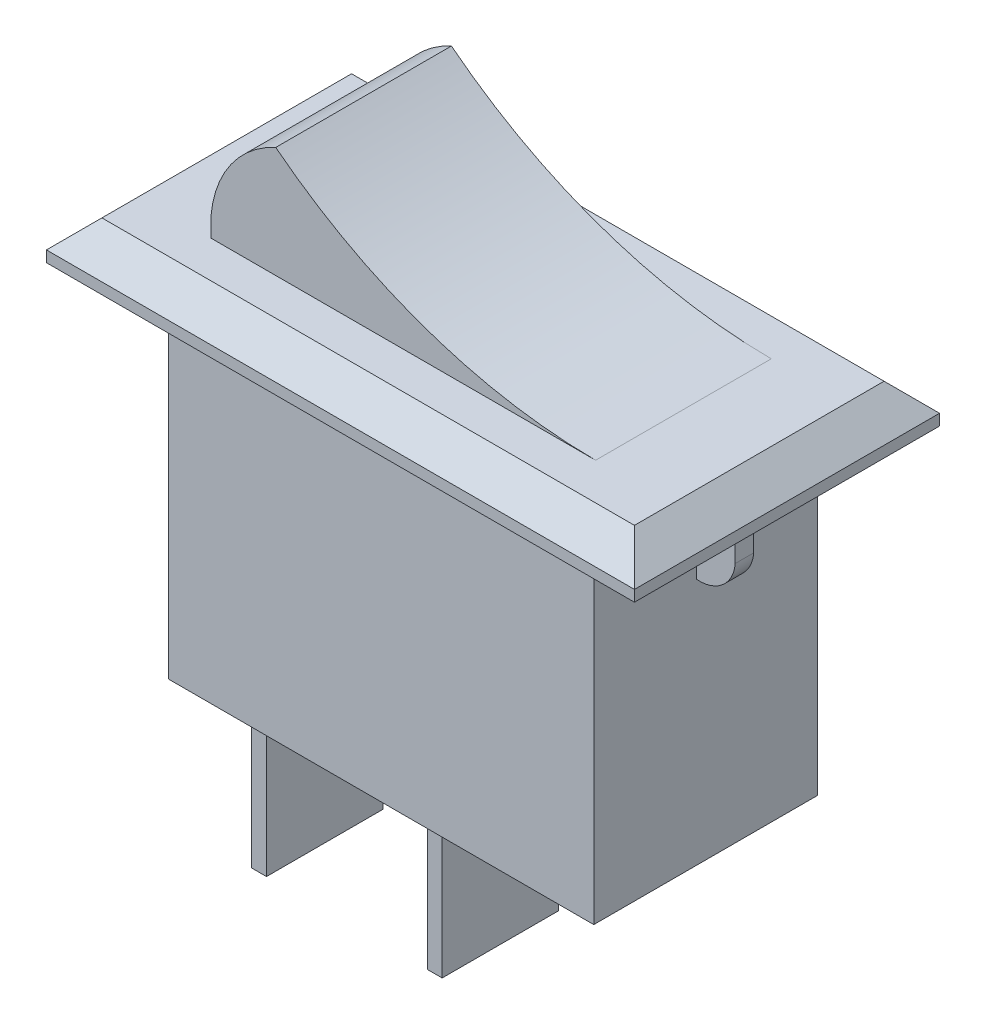
ISO-10303-21;
HEADER;
FILE_DESCRIPTION(('STEP AP214'),'2;1');
FILE_NAME('part.step','',(''),(''),'','','');
FILE_SCHEMA(('AUTOMOTIVE_DESIGN { 1 0 10303 214 1 1 1 1 }'));
ENDSEC;
DATA;
#1=APPLICATION_CONTEXT('core data for automotive mechanical design processes');
#2=APPLICATION_PROTOCOL_DEFINITION('international standard','automotive_design',2000,#1);
#3=PRODUCT_CONTEXT('',#1,'mechanical');
#4=PRODUCT('Part','Part','',(#3));
#5=PRODUCT_RELATED_PRODUCT_CATEGORY('part','',(#4));
#6=PRODUCT_DEFINITION_FORMATION('','',#4);
#7=PRODUCT_DEFINITION_CONTEXT('part definition',#1,'design');
#8=PRODUCT_DEFINITION('design','',#6,#7);
#9=PRODUCT_DEFINITION_SHAPE('','',#8);
#10=(LENGTH_UNIT() NAMED_UNIT(*) SI_UNIT(.MILLI.,.METRE.));
#11=(NAMED_UNIT(*) PLANE_ANGLE_UNIT() SI_UNIT($,.RADIAN.));
#12=(NAMED_UNIT(*) SI_UNIT($,.STERADIAN.) SOLID_ANGLE_UNIT());
#13=UNCERTAINTY_MEASURE_WITH_UNIT(LENGTH_MEASURE(1.E-05),#10,'distance_accuracy_value','');
#14=(GEOMETRIC_REPRESENTATION_CONTEXT(3) GLOBAL_UNCERTAINTY_ASSIGNED_CONTEXT((#13)) GLOBAL_UNIT_ASSIGNED_CONTEXT((#10,
#11,#12)) REPRESENTATION_CONTEXT('',''));
#15=CARTESIAN_POINT('',(0.,0.,0.));
#16=DIRECTION('',(0.,0.,1.));
#17=DIRECTION('',(1.,0.,0.));
#18=AXIS2_PLACEMENT_3D('',#15,#16,#17);
#19=CARTESIAN_POINT('',(0.999999999999998,26.5,-1.3));
#20=DIRECTION('',(0.,0.,-1.));
#21=DIRECTION('',(-1.,0.,0.));
#22=AXIS2_PLACEMENT_3D('',#19,#20,#21);
#23=PLANE('',#22);
#24=DIRECTION('',(1.,0.,0.));
#25=VECTOR('',#24,1.);
#26=CARTESIAN_POINT('',(0.999999999999998,20.5,-1.3));
#27=LINE('',#26,#25);
#28=CARTESIAN_POINT('',(0.999999999999998,20.5,-1.3));
#29=VERTEX_POINT('',#28);
#30=CARTESIAN_POINT('',(21.7997594752728,20.5,-1.3));
#31=VERTEX_POINT('',#30);
#32=EDGE_CURVE('E284',#29,#31,#27,.T.);
#33=ORIENTED_EDGE('',*,*,#32,.T.);
#34=CARTESIAN_POINT('',(21.8998797376371,48.7288159014414,-1.3));
#35=DIRECTION('',(0.,0.,1.));
#36=DIRECTION('',(1.,0.,0.));
#37=AXIS2_PLACEMENT_3D('',#34,#35,#36);
#38=CIRCLE('',#37,28.2289934511383);
#39=CARTESIAN_POINT('',(4.5,26.5,-1.3));
#40=VERTEX_POINT('',#39);
#41=EDGE_CURVE('E275',#40,#31,#38,.T.);
#42=ORIENTED_EDGE('',*,*,#41,.F.);
#43=CARTESIAN_POINT('',(6.99755623346389,21.0222588638127,-1.3));
#44=DIRECTION('',(0.,0.,1.));
#45=DIRECTION('',(1.,0.,0.));
#46=AXIS2_PLACEMENT_3D('',#43,#44,#45);
#47=CIRCLE('',#46,6.02025207897415);
#48=CARTESIAN_POINT('',(0.999999999999997,21.5445177276255,-1.3));
#49=VERTEX_POINT('',#48);
#50=EDGE_CURVE('E283',#49,#40,#47,.F.);
#51=ORIENTED_EDGE('',*,*,#50,.F.);
#52=DIRECTION('',(0.,-1.,0.));
#53=VECTOR('',#52,1.);
#54=CARTESIAN_POINT('',(0.999999999999998,26.5,-1.3));
#55=LINE('',#54,#53);
#56=EDGE_CURVE('E83',#49,#29,#55,.T.);
#57=ORIENTED_EDGE('',*,*,#56,.T.);
#58=EDGE_LOOP('',(#33,#42,#51,#57));
#59=FACE_BOUND('',#58,.T.);
#60=ADVANCED_FACE('F57',(#59),#23,.F.);
#61=CARTESIAN_POINT('',(0.999999999999997,26.5,-10.8));
#62=DIRECTION('',(0.,0.,1.));
#63=DIRECTION('',(1.,0.,0.));
#64=AXIS2_PLACEMENT_3D('',#61,#62,#63);
#65=PLANE('',#64);
#66=CARTESIAN_POINT('',(6.99755623346389,21.0222588638127,-10.8));
#67=DIRECTION('',(0.,0.,1.));
#68=DIRECTION('',(1.,0.,0.));
#69=AXIS2_PLACEMENT_3D('',#66,#67,#68);
#70=CIRCLE('',#69,6.02025207897415);
#71=CARTESIAN_POINT('',(4.5,26.5,-10.8));
#72=VERTEX_POINT('',#71);
#73=CARTESIAN_POINT('',(0.999999999999997,21.5445177276255,-10.8));
#74=VERTEX_POINT('',#73);
#75=EDGE_CURVE('E280',#72,#74,#70,.T.);
#76=ORIENTED_EDGE('',*,*,#75,.F.);
#77=CARTESIAN_POINT('',(21.8998797376371,48.7288159014414,-10.8));
#78=DIRECTION('',(0.,0.,1.));
#79=DIRECTION('',(1.,0.,0.));
#80=AXIS2_PLACEMENT_3D('',#77,#78,#79);
#81=CIRCLE('',#80,28.2289934511383);
#82=CARTESIAN_POINT('',(21.7997594752728,20.5,-10.8));
#83=VERTEX_POINT('',#82);
#84=EDGE_CURVE('E276',#83,#72,#81,.F.);
#85=ORIENTED_EDGE('',*,*,#84,.F.);
#86=DIRECTION('',(-1.,0.,0.));
#87=VECTOR('',#86,1.);
#88=CARTESIAN_POINT('',(0.999999999999997,20.5,-10.8));
#89=LINE('',#88,#87);
#90=CARTESIAN_POINT('',(0.999999999999997,20.5,-10.8));
#91=VERTEX_POINT('',#90);
#92=EDGE_CURVE('E75',#83,#91,#89,.T.);
#93=ORIENTED_EDGE('',*,*,#92,.T.);
#94=DIRECTION('',(0.,-1.,0.));
#95=VECTOR('',#94,1.);
#96=CARTESIAN_POINT('',(0.999999999999997,26.5,-10.8));
#97=LINE('',#96,#95);
#98=EDGE_CURVE('E300',#74,#91,#97,.T.);
#99=ORIENTED_EDGE('',*,*,#98,.F.);
#100=EDGE_LOOP('',(#76,#85,#93,#99));
#101=FACE_BOUND('',#100,.T.);
#102=ADVANCED_FACE('F550',(#101),#65,.F.);
#103=CARTESIAN_POINT('',(0.,20.5,0.));
#104=DIRECTION('',(0.,-1.,0.));
#105=DIRECTION('',(0.,0.,-1.));
#106=AXIS2_PLACEMENT_3D('',#103,#104,#105);
#107=PLANE('',#106);
#108=ORIENTED_EDGE('',*,*,#92,.F.);
#109=DIRECTION('',(0.,0.,1.));
#110=VECTOR('',#109,1.);
#111=CARTESIAN_POINT('',(21.7997594752728,20.5,-29.3));
#112=LINE('',#111,#110);
#113=EDGE_CURVE('E285',#83,#31,#112,.T.);
#114=ORIENTED_EDGE('',*,*,#113,.T.);
#115=ORIENTED_EDGE('',*,*,#32,.F.);
#116=DIRECTION('',(0.,0.,1.));
#117=VECTOR('',#116,1.);
#118=CARTESIAN_POINT('',(0.999999999999997,20.5,-10.8));
#119=LINE('',#118,#117);
#120=EDGE_CURVE('E295',#91,#29,#119,.T.);
#121=ORIENTED_EDGE('',*,*,#120,.F.);
#122=EDGE_LOOP('',(#108,#114,#115,#121));
#123=FACE_BOUND('',#122,.T.);
#124=DIRECTION('',(0.,0.,-1.));
#125=VECTOR('',#124,1.);
#126=CARTESIAN_POINT('',(25.9,20.5,0.));
#127=LINE('',#126,#125);
#128=CARTESIAN_POINT('',(25.9,20.5,0.699999999999999));
#129=VERTEX_POINT('',#128);
#130=CARTESIAN_POINT('',(25.9,20.5,-12.8));
#131=VERTEX_POINT('',#130);
#132=EDGE_CURVE('E493',#129,#131,#127,.T.);
#133=ORIENTED_EDGE('',*,*,#132,.T.);
#134=DIRECTION('',(-1.,0.,0.));
#135=VECTOR('',#134,1.);
#136=CARTESIAN_POINT('',(0.,20.5,-12.8));
#137=LINE('',#136,#135);
#138=CARTESIAN_POINT('',(-2.9,20.5,-12.8));
#139=VERTEX_POINT('',#138);
#140=EDGE_CURVE('E495',#131,#139,#137,.T.);
#141=ORIENTED_EDGE('',*,*,#140,.T.);
#142=DIRECTION('',(0.,0.,1.));
#143=VECTOR('',#142,1.);
#144=CARTESIAN_POINT('',(-2.9,20.5,0.));
#145=LINE('',#144,#143);
#146=CARTESIAN_POINT('',(-2.9,20.5,0.699999999999999));
#147=VERTEX_POINT('',#146);
#148=EDGE_CURVE('E489',#139,#147,#145,.T.);
#149=ORIENTED_EDGE('',*,*,#148,.T.);
#150=DIRECTION('',(1.,0.,0.));
#151=VECTOR('',#150,1.);
#152=CARTESIAN_POINT('',(0.,20.5,0.699999999999999));
#153=LINE('',#152,#151);
#154=EDGE_CURVE('E491',#147,#129,#153,.T.);
#155=ORIENTED_EDGE('',*,*,#154,.T.);
#156=EDGE_LOOP('',(#133,#141,#149,#155));
#157=FACE_BOUND('',#156,.T.);
#158=ADVANCED_FACE('F547',(#123,#157),#107,.F.);
#159=CARTESIAN_POINT('',(25.1,18.4,-6.55000000000001));
#160=DIRECTION('',(0.,0.,-1.));
#161=DIRECTION('',(-1.,0.,0.));
#162=AXIS2_PLACEMENT_3D('',#159,#160,#161);
#163=PLANE('',#162);
#164=DIRECTION('',(0.,-1.,0.));
#165=VECTOR('',#164,1.);
#166=CARTESIAN_POINT('',(25.1,18.4,-6.55000000000001));
#167=LINE('',#166,#165);
#168=CARTESIAN_POINT('',(25.1,18.4,-6.55000000000001));
#169=VERTEX_POINT('',#168);
#170=CARTESIAN_POINT('',(25.1,15.1876916984151,-6.55000000000001));
#171=VERTEX_POINT('',#170);
#172=EDGE_CURVE('E315',#169,#171,#167,.T.);
#173=ORIENTED_EDGE('',*,*,#172,.T.);
#174=CARTESIAN_POINT('',(23.1561541507925,15.3438458492075,-6.55000000000001));
#175=DIRECTION('',(0.,0.,1.));
#176=DIRECTION('',(1.,0.,0.));
#177=AXIS2_PLACEMENT_3D('',#174,#175,#176);
#178=CIRCLE('',#177,1.95010789555118);
#179=CARTESIAN_POINT('',(23.3123083015849,13.4,-6.55000000000001));
#180=VERTEX_POINT('',#179);
#181=EDGE_CURVE('E304',#171,#180,#178,.F.);
#182=ORIENTED_EDGE('',*,*,#181,.T.);
#183=DIRECTION('',(-1.,0.,0.));
#184=VECTOR('',#183,1.);
#185=CARTESIAN_POINT('',(25.1,13.4,-6.55000000000001));
#186=LINE('',#185,#184);
#187=CARTESIAN_POINT('',(23.,13.4,-6.55000000000001));
#188=VERTEX_POINT('',#187);
#189=EDGE_CURVE('E324',#180,#188,#186,.T.);
#190=ORIENTED_EDGE('',*,*,#189,.T.);
#191=DIRECTION('',(0.,-1.,0.));
#192=VECTOR('',#191,1.);
#193=CARTESIAN_POINT('',(23.,18.4,-6.55000000000001));
#194=LINE('',#193,#192);
#195=CARTESIAN_POINT('',(23.,18.4,-6.55000000000001));
#196=VERTEX_POINT('',#195);
#197=EDGE_CURVE('E307',#196,#188,#194,.T.);
#198=ORIENTED_EDGE('',*,*,#197,.F.);
#199=DIRECTION('',(-1.,0.,0.));
#200=VECTOR('',#199,1.);
#201=CARTESIAN_POINT('',(25.1,18.4,-6.55000000000001));
#202=LINE('',#201,#200);
#203=EDGE_CURVE('E337',#169,#196,#202,.T.);
#204=ORIENTED_EDGE('',*,*,#203,.F.);
#205=EDGE_LOOP('',(#173,#182,#190,#198,#204));
#206=FACE_BOUND('',#205,.T.);
#207=ADVANCED_FACE('F549',(#206),#163,.T.);
#208=CARTESIAN_POINT('',(25.1,18.4,-5.55000000000001));
#209=DIRECTION('',(0.,0.,1.));
#210=DIRECTION('',(1.,0.,0.));
#211=AXIS2_PLACEMENT_3D('',#208,#209,#210);
#212=PLANE('',#211);
#213=DIRECTION('',(-1.,0.,0.));
#214=VECTOR('',#213,1.);
#215=CARTESIAN_POINT('',(25.1,13.4,-5.55000000000001));
#216=LINE('',#215,#214);
#217=CARTESIAN_POINT('',(23.3123083015849,13.4,-5.55000000000001));
#218=VERTEX_POINT('',#217);
#219=CARTESIAN_POINT('',(23.,13.4,-5.55000000000001));
#220=VERTEX_POINT('',#219);
#221=EDGE_CURVE('E333',#218,#220,#216,.T.);
#222=ORIENTED_EDGE('',*,*,#221,.F.);
#223=CARTESIAN_POINT('',(23.1561541507925,15.3438458492075,-5.55000000000001));
#224=DIRECTION('',(0.,0.,-1.));
#225=DIRECTION('',(-1.,0.,0.));
#226=AXIS2_PLACEMENT_3D('',#223,#224,#225);
#227=CIRCLE('',#226,1.95010789555118);
#228=CARTESIAN_POINT('',(25.1,15.1876916984151,-5.55000000000001));
#229=VERTEX_POINT('',#228);
#230=EDGE_CURVE('E303',#218,#229,#227,.F.);
#231=ORIENTED_EDGE('',*,*,#230,.T.);
#232=DIRECTION('',(0.,1.,0.));
#233=VECTOR('',#232,1.);
#234=CARTESIAN_POINT('',(25.1,18.4,-5.55000000000001));
#235=LINE('',#234,#233);
#236=CARTESIAN_POINT('',(25.1,18.4,-5.55000000000001));
#237=VERTEX_POINT('',#236);
#238=EDGE_CURVE('E322',#229,#237,#235,.T.);
#239=ORIENTED_EDGE('',*,*,#238,.T.);
#240=DIRECTION('',(-1.,0.,0.));
#241=VECTOR('',#240,1.);
#242=CARTESIAN_POINT('',(25.1,18.4,-5.55000000000001));
#243=LINE('',#242,#241);
#244=CARTESIAN_POINT('',(23.,18.4,-5.55000000000001));
#245=VERTEX_POINT('',#244);
#246=EDGE_CURVE('E335',#237,#245,#243,.T.);
#247=ORIENTED_EDGE('',*,*,#246,.T.);
#248=DIRECTION('',(0.,1.,0.));
#249=VECTOR('',#248,1.);
#250=CARTESIAN_POINT('',(23.,18.4,-5.55000000000001));
#251=LINE('',#250,#249);
#252=EDGE_CURVE('E327',#220,#245,#251,.T.);
#253=ORIENTED_EDGE('',*,*,#252,.F.);
#254=EDGE_LOOP('',(#222,#231,#239,#247,#253));
#255=FACE_BOUND('',#254,.T.);
#256=ADVANCED_FACE('F557',(#255),#212,.T.);
#257=CARTESIAN_POINT('',(25.1,13.4,-6.55000000000001));
#258=DIRECTION('',(0.,-1.,0.));
#259=DIRECTION('',(0.,0.,-1.));
#260=AXIS2_PLACEMENT_3D('',#257,#258,#259);
#261=PLANE('',#260);
#262=ORIENTED_EDGE('',*,*,#189,.F.);
#263=DIRECTION('',(0.,0.,1.));
#264=VECTOR('',#263,1.);
#265=CARTESIAN_POINT('',(23.3123083015849,13.4,-9.07817784524037));
#266=LINE('',#265,#264);
#267=EDGE_CURVE('E308',#180,#218,#266,.T.);
#268=ORIENTED_EDGE('',*,*,#267,.T.);
#269=ORIENTED_EDGE('',*,*,#221,.T.);
#270=DIRECTION('',(0.,0.,1.));
#271=VECTOR('',#270,1.);
#272=CARTESIAN_POINT('',(23.,13.4,-6.55000000000001));
#273=LINE('',#272,#271);
#274=EDGE_CURVE('E319',#188,#220,#273,.T.);
#275=ORIENTED_EDGE('',*,*,#274,.F.);
#276=EDGE_LOOP('',(#262,#268,#269,#275));
#277=FACE_BOUND('',#276,.T.);
#278=ADVANCED_FACE('F582',(#277),#261,.T.);
#279=CARTESIAN_POINT('',(25.1,0.,0.));
#280=DIRECTION('',(1.,0.,0.));
#281=DIRECTION('',(0.,0.,1.));
#282=AXIS2_PLACEMENT_3D('',#279,#280,#281);
#283=PLANE('',#282);
#284=ORIENTED_EDGE('',*,*,#238,.F.);
#285=DIRECTION('',(0.,0.,1.));
#286=VECTOR('',#285,1.);
#287=CARTESIAN_POINT('',(25.1,15.1876916984151,-9.07817784524037));
#288=LINE('',#287,#286);
#289=EDGE_CURVE('E311',#171,#229,#288,.T.);
#290=ORIENTED_EDGE('',*,*,#289,.F.);
#291=ORIENTED_EDGE('',*,*,#172,.F.);
#292=DIRECTION('',(0.,0.,-1.));
#293=VECTOR('',#292,1.);
#294=CARTESIAN_POINT('',(25.1,18.4,-6.55000000000001));
#295=LINE('',#294,#293);
#296=EDGE_CURVE('E318',#237,#169,#295,.T.);
#297=ORIENTED_EDGE('',*,*,#296,.F.);
#298=EDGE_LOOP('',(#284,#290,#291,#297));
#299=FACE_BOUND('',#298,.T.);
#300=ADVANCED_FACE('F578',(#299),#283,.T.);
#301=CARTESIAN_POINT('',(-2.1,18.4,-6.55));
#302=DIRECTION('',(0.,0.,1.));
#303=DIRECTION('',(1.,0.,0.));
#304=AXIS2_PLACEMENT_3D('',#301,#302,#303);
#305=PLANE('',#304);
#306=DIRECTION('',(1.,0.,0.));
#307=VECTOR('',#306,1.);
#308=CARTESIAN_POINT('',(-2.1,13.4,-6.55));
#309=LINE('',#308,#307);
#310=CARTESIAN_POINT('',(-0.312308301584943,13.4,-6.55));
#311=VERTEX_POINT('',#310);
#312=CARTESIAN_POINT('',(0.,13.4,-6.55));
#313=VERTEX_POINT('',#312);
#314=EDGE_CURVE('E373',#311,#313,#309,.T.);
#315=ORIENTED_EDGE('',*,*,#314,.F.);
#316=CARTESIAN_POINT('',(-0.15615415079247,15.3438458492075,-6.55));
#317=DIRECTION('',(0.,0.,1.));
#318=DIRECTION('',(1.,0.,0.));
#319=AXIS2_PLACEMENT_3D('',#316,#317,#318);
#320=CIRCLE('',#319,1.95010789555118);
#321=CARTESIAN_POINT('',(-2.1,15.1876916984151,-6.55));
#322=VERTEX_POINT('',#321);
#323=EDGE_CURVE('E346',#322,#311,#320,.T.);
#324=ORIENTED_EDGE('',*,*,#323,.F.);
#325=DIRECTION('',(0.,-1.,0.));
#326=VECTOR('',#325,1.);
#327=CARTESIAN_POINT('',(-2.1,18.4,-6.55));
#328=LINE('',#327,#326);
#329=CARTESIAN_POINT('',(-2.1,18.4,-6.55));
#330=VERTEX_POINT('',#329);
#331=EDGE_CURVE('E350',#330,#322,#328,.T.);
#332=ORIENTED_EDGE('',*,*,#331,.F.);
#333=DIRECTION('',(1.,0.,0.));
#334=VECTOR('',#333,1.);
#335=CARTESIAN_POINT('',(-2.1,18.4,-6.55));
#336=LINE('',#335,#334);
#337=CARTESIAN_POINT('',(0.,18.4,-6.55));
#338=VERTEX_POINT('',#337);
#339=EDGE_CURVE('E359',#330,#338,#336,.T.);
#340=ORIENTED_EDGE('',*,*,#339,.T.);
#341=DIRECTION('',(0.,-1.,0.));
#342=VECTOR('',#341,1.);
#343=CARTESIAN_POINT('',(0.,18.4,-6.55));
#344=LINE('',#343,#342);
#345=EDGE_CURVE('E349',#338,#313,#344,.T.);
#346=ORIENTED_EDGE('',*,*,#345,.T.);
#347=EDGE_LOOP('',(#315,#324,#332,#340,#346));
#348=FACE_BOUND('',#347,.T.);
#349=ADVANCED_FACE('F581',(#348),#305,.F.);
#350=CARTESIAN_POINT('',(-2.1,18.4,-5.55));
#351=DIRECTION('',(0.,0.,-1.));
#352=DIRECTION('',(-1.,0.,0.));
#353=AXIS2_PLACEMENT_3D('',#350,#351,#352);
#354=PLANE('',#353);
#355=DIRECTION('',(0.,1.,0.));
#356=VECTOR('',#355,1.);
#357=CARTESIAN_POINT('',(-2.1,18.4,-5.55));
#358=LINE('',#357,#356);
#359=CARTESIAN_POINT('',(-2.1,15.1876916984151,-5.55));
#360=VERTEX_POINT('',#359);
#361=CARTESIAN_POINT('',(-2.1,18.4,-5.55));
#362=VERTEX_POINT('',#361);
#363=EDGE_CURVE('E353',#360,#362,#358,.T.);
#364=ORIENTED_EDGE('',*,*,#363,.F.);
#365=CARTESIAN_POINT('',(-0.15615415079247,15.3438458492075,-5.55));
#366=DIRECTION('',(0.,0.,1.));
#367=DIRECTION('',(1.,0.,0.));
#368=AXIS2_PLACEMENT_3D('',#365,#366,#367);
#369=CIRCLE('',#368,1.95010789555118);
#370=CARTESIAN_POINT('',(-0.312308301584943,13.4,-5.55));
#371=VERTEX_POINT('',#370);
#372=EDGE_CURVE('E340',#371,#360,#369,.F.);
#373=ORIENTED_EDGE('',*,*,#372,.F.);
#374=DIRECTION('',(1.,0.,0.));
#375=VECTOR('',#374,1.);
#376=CARTESIAN_POINT('',(-2.1,13.4,-5.55));
#377=LINE('',#376,#375);
#378=CARTESIAN_POINT('',(0.,13.4,-5.55));
#379=VERTEX_POINT('',#378);
#380=EDGE_CURVE('E371',#371,#379,#377,.T.);
#381=ORIENTED_EDGE('',*,*,#380,.T.);
#382=DIRECTION('',(0.,1.,0.));
#383=VECTOR('',#382,1.);
#384=CARTESIAN_POINT('',(0.,18.4,-5.55));
#385=LINE('',#384,#383);
#386=CARTESIAN_POINT('',(0.,18.4,-5.55));
#387=VERTEX_POINT('',#386);
#388=EDGE_CURVE('E354',#379,#387,#385,.T.);
#389=ORIENTED_EDGE('',*,*,#388,.T.);
#390=DIRECTION('',(1.,0.,0.));
#391=VECTOR('',#390,1.);
#392=CARTESIAN_POINT('',(-2.1,18.4,-5.55));
#393=LINE('',#392,#391);
#394=EDGE_CURVE('E369',#362,#387,#393,.T.);
#395=ORIENTED_EDGE('',*,*,#394,.F.);
#396=EDGE_LOOP('',(#364,#373,#381,#389,#395));
#397=FACE_BOUND('',#396,.T.);
#398=ADVANCED_FACE('F598',(#397),#354,.F.);
#399=CARTESIAN_POINT('',(0.,18.4,0.));
#400=DIRECTION('',(1.,0.,0.));
#401=DIRECTION('',(0.,0.,-1.));
#402=AXIS2_PLACEMENT_3D('',#399,#400,#401);
#403=PLANE('',#402);
#404=ORIENTED_EDGE('',*,*,#345,.F.);
#405=DIRECTION('',(0.,0.,1.));
#406=VECTOR('',#405,1.);
#407=CARTESIAN_POINT('',(0.,18.4,0.));
#408=LINE('',#407,#406);
#409=CARTESIAN_POINT('',(0.,18.4,-12.1));
#410=VERTEX_POINT('',#409);
#411=EDGE_CURVE('E455',#410,#338,#408,.T.);
#412=ORIENTED_EDGE('',*,*,#411,.F.);
#413=DIRECTION('',(0.,-1.,0.));
#414=VECTOR('',#413,1.);
#415=CARTESIAN_POINT('',(0.,18.4,-12.1));
#416=LINE('',#415,#414);
#417=CARTESIAN_POINT('',(0.,0.,-12.1));
#418=VERTEX_POINT('',#417);
#419=EDGE_CURVE('E469',#410,#418,#416,.T.);
#420=ORIENTED_EDGE('',*,*,#419,.T.);
#421=DIRECTION('',(0.,0.,1.));
#422=VECTOR('',#421,1.);
#423=CARTESIAN_POINT('',(0.,0.,0.));
#424=LINE('',#423,#422);
#425=CARTESIAN_POINT('',(0.,0.,0.));
#426=VERTEX_POINT('',#425);
#427=EDGE_CURVE('E454',#418,#426,#424,.T.);
#428=ORIENTED_EDGE('',*,*,#427,.T.);
#429=DIRECTION('',(0.,-1.,0.));
#430=VECTOR('',#429,1.);
#431=CARTESIAN_POINT('',(0.,18.4,0.));
#432=LINE('',#431,#430);
#433=CARTESIAN_POINT('',(0.,18.4,0.));
#434=VERTEX_POINT('',#433);
#435=EDGE_CURVE('E486',#434,#426,#432,.T.);
#436=ORIENTED_EDGE('',*,*,#435,.F.);
#437=EDGE_CURVE('E459',#387,#434,#408,.T.);
#438=ORIENTED_EDGE('',*,*,#437,.F.);
#439=ORIENTED_EDGE('',*,*,#388,.F.);
#440=DIRECTION('',(0.,0.,1.));
#441=VECTOR('',#440,1.);
#442=CARTESIAN_POINT('',(0.,13.4,-6.55));
#443=LINE('',#442,#441);
#444=EDGE_CURVE('E362',#313,#379,#443,.T.);
#445=ORIENTED_EDGE('',*,*,#444,.F.);
#446=EDGE_LOOP('',(#404,#412,#420,#428,#436,#438,#439,#445));
#447=FACE_BOUND('',#446,.T.);
#448=ADVANCED_FACE('F601',(#447),#403,.F.);
#449=CARTESIAN_POINT('',(0.,18.4,0.));
#450=DIRECTION('',(0.,-1.,0.));
#451=DIRECTION('',(0.,0.,-1.));
#452=AXIS2_PLACEMENT_3D('',#449,#450,#451);
#453=PLANE('',#452);
#454=ORIENTED_EDGE('',*,*,#203,.T.);
#455=DIRECTION('',(0.,0.,-1.));
#456=VECTOR('',#455,1.);
#457=CARTESIAN_POINT('',(23.,18.4,0.));
#458=LINE('',#457,#456);
#459=CARTESIAN_POINT('',(23.,18.4,-12.1));
#460=VERTEX_POINT('',#459);
#461=EDGE_CURVE('E462',#196,#460,#458,.T.);
#462=ORIENTED_EDGE('',*,*,#461,.T.);
#463=DIRECTION('',(-1.,0.,0.));
#464=VECTOR('',#463,1.);
#465=CARTESIAN_POINT('',(0.,18.4,-12.1));
#466=LINE('',#465,#464);
#467=EDGE_CURVE('E466',#460,#410,#466,.T.);
#468=ORIENTED_EDGE('',*,*,#467,.T.);
#469=ORIENTED_EDGE('',*,*,#411,.T.);
#470=ORIENTED_EDGE('',*,*,#339,.F.);
#471=DIRECTION('',(0.,0.,-1.));
#472=VECTOR('',#471,1.);
#473=CARTESIAN_POINT('',(-2.1,18.4,-6.55));
#474=LINE('',#473,#472);
#475=EDGE_CURVE('E356',#362,#330,#474,.T.);
#476=ORIENTED_EDGE('',*,*,#475,.F.);
#477=ORIENTED_EDGE('',*,*,#394,.T.);
#478=ORIENTED_EDGE('',*,*,#437,.T.);
#479=DIRECTION('',(1.,0.,0.));
#480=VECTOR('',#479,1.);
#481=CARTESIAN_POINT('',(0.,18.4,0.));
#482=LINE('',#481,#480);
#483=CARTESIAN_POINT('',(23.,18.4,0.));
#484=VERTEX_POINT('',#483);
#485=EDGE_CURVE('E458',#434,#484,#482,.T.);
#486=ORIENTED_EDGE('',*,*,#485,.T.);
#487=EDGE_CURVE('E463',#484,#245,#458,.T.);
#488=ORIENTED_EDGE('',*,*,#487,.T.);
#489=ORIENTED_EDGE('',*,*,#246,.F.);
#490=ORIENTED_EDGE('',*,*,#296,.T.);
#491=EDGE_LOOP('',(#454,#462,#468,#469,#470,#476,#477,#478,#486,#488,#489,#490));
#492=FACE_BOUND('',#491,.T.);
#493=DIRECTION('',(0.,0.,1.));
#494=VECTOR('',#493,1.);
#495=CARTESIAN_POINT('',(-4.4,18.4,2.2));
#496=LINE('',#495,#494);
#497=CARTESIAN_POINT('',(-4.4,18.4,-14.3));
#498=VERTEX_POINT('',#497);
#499=CARTESIAN_POINT('',(-4.4,18.4,2.2));
#500=VERTEX_POINT('',#499);
#501=EDGE_CURVE('E376',#498,#500,#496,.T.);
#502=ORIENTED_EDGE('',*,*,#501,.F.);
#503=DIRECTION('',(-1.,0.,0.));
#504=VECTOR('',#503,1.);
#505=CARTESIAN_POINT('',(-4.4,18.4,-14.3));
#506=LINE('',#505,#504);
#507=CARTESIAN_POINT('',(27.4,18.4,-14.3));
#508=VERTEX_POINT('',#507);
#509=EDGE_CURVE('E385',#508,#498,#506,.T.);
#510=ORIENTED_EDGE('',*,*,#509,.F.);
#511=DIRECTION('',(0.,0.,-1.));
#512=VECTOR('',#511,1.);
#513=CARTESIAN_POINT('',(27.4,18.4,2.2));
#514=LINE('',#513,#512);
#515=CARTESIAN_POINT('',(27.4,18.4,2.2));
#516=VERTEX_POINT('',#515);
#517=EDGE_CURVE('E382',#516,#508,#514,.T.);
#518=ORIENTED_EDGE('',*,*,#517,.F.);
#519=DIRECTION('',(1.,0.,0.));
#520=VECTOR('',#519,1.);
#521=CARTESIAN_POINT('',(-4.4,18.4,2.2));
#522=LINE('',#521,#520);
#523=EDGE_CURVE('E379',#500,#516,#522,.T.);
#524=ORIENTED_EDGE('',*,*,#523,.F.);
#525=EDGE_LOOP('',(#502,#510,#518,#524));
#526=FACE_BOUND('',#525,.T.);
#527=ADVANCED_FACE('F533',(#492,#526),#453,.T.);
#528=CARTESIAN_POINT('',(0.,0.,0.));
#529=DIRECTION('',(0.,-1.,0.));
#530=DIRECTION('',(0.,0.,-1.));
#531=AXIS2_PLACEMENT_3D('',#528,#529,#530);
#532=PLANE('',#531);
#533=ORIENTED_EDGE('',*,*,#427,.F.);
#534=DIRECTION('',(-1.,0.,0.));
#535=VECTOR('',#534,1.);
#536=CARTESIAN_POINT('',(0.,0.,-12.1));
#537=LINE('',#536,#535);
#538=CARTESIAN_POINT('',(23.,0.,-12.1));
#539=VERTEX_POINT('',#538);
#540=EDGE_CURVE('E476',#539,#418,#537,.T.);
#541=ORIENTED_EDGE('',*,*,#540,.F.);
#542=DIRECTION('',(0.,0.,-1.));
#543=VECTOR('',#542,1.);
#544=CARTESIAN_POINT('',(23.,0.,0.));
#545=LINE('',#544,#543);
#546=CARTESIAN_POINT('',(23.,0.,0.));
#547=VERTEX_POINT('',#546);
#548=EDGE_CURVE('E474',#547,#539,#545,.T.);
#549=ORIENTED_EDGE('',*,*,#548,.F.);
#550=DIRECTION('',(1.,0.,0.));
#551=VECTOR('',#550,1.);
#552=CARTESIAN_POINT('',(0.,0.,0.));
#553=LINE('',#552,#551);
#554=EDGE_CURVE('E472',#426,#547,#553,.T.);
#555=ORIENTED_EDGE('',*,*,#554,.F.);
#556=EDGE_LOOP('',(#533,#541,#549,#555));
#557=FACE_BOUND('',#556,.T.);
#558=DIRECTION('',(1.,0.,0.));
#559=VECTOR('',#558,1.);
#560=CARTESIAN_POINT('',(1.6,0.,-9.2));
#561=LINE('',#560,#559);
#562=CARTESIAN_POINT('',(1.6,0.,-9.2));
#563=VERTEX_POINT('',#562);
#564=CARTESIAN_POINT('',(2.4,0.,-9.2));
#565=VERTEX_POINT('',#564);
#566=EDGE_CURVE('E439',#563,#565,#561,.T.);
#567=ORIENTED_EDGE('',*,*,#566,.F.);
#568=DIRECTION('',(0.,0.,-1.));
#569=VECTOR('',#568,1.);
#570=CARTESIAN_POINT('',(1.6,0.,-2.9));
#571=LINE('',#570,#569);
#572=CARTESIAN_POINT('',(1.6,0.,-2.9));
#573=VERTEX_POINT('',#572);
#574=EDGE_CURVE('E425',#573,#563,#571,.T.);
#575=ORIENTED_EDGE('',*,*,#574,.F.);
#576=DIRECTION('',(-1.,0.,0.));
#577=VECTOR('',#576,1.);
#578=CARTESIAN_POINT('',(1.6,0.,-2.9));
#579=LINE('',#578,#577);
#580=CARTESIAN_POINT('',(2.4,0.,-2.9));
#581=VERTEX_POINT('',#580);
#582=EDGE_CURVE('E430',#581,#573,#579,.T.);
#583=ORIENTED_EDGE('',*,*,#582,.F.);
#584=DIRECTION('',(0.,0.,1.));
#585=VECTOR('',#584,1.);
#586=CARTESIAN_POINT('',(2.4,0.,-2.9));
#587=LINE('',#586,#585);
#588=EDGE_CURVE('E441',#565,#581,#587,.T.);
#589=ORIENTED_EDGE('',*,*,#588,.F.);
#590=EDGE_LOOP('',(#567,#575,#583,#589));
#591=FACE_BOUND('',#590,.T.);
#592=DIRECTION('',(1.,0.,0.));
#593=VECTOR('',#592,1.);
#594=CARTESIAN_POINT('',(11.1,0.,-9.19999999999999));
#595=LINE('',#594,#593);
#596=CARTESIAN_POINT('',(11.1,0.,-9.19999999999999));
#597=VERTEX_POINT('',#596);
#598=CARTESIAN_POINT('',(11.9,0.,-9.19999999999999));
#599=VERTEX_POINT('',#598);
#600=EDGE_CURVE('E410',#597,#599,#595,.T.);
#601=ORIENTED_EDGE('',*,*,#600,.F.);
#602=DIRECTION('',(0.,0.,-1.));
#603=VECTOR('',#602,1.);
#604=CARTESIAN_POINT('',(11.1,0.,-2.9));
#605=LINE('',#604,#603);
#606=CARTESIAN_POINT('',(11.1,0.,-2.9));
#607=VERTEX_POINT('',#606);
#608=EDGE_CURVE('E396',#607,#597,#605,.T.);
#609=ORIENTED_EDGE('',*,*,#608,.F.);
#610=DIRECTION('',(-1.,0.,0.));
#611=VECTOR('',#610,1.);
#612=CARTESIAN_POINT('',(11.1,0.,-2.9));
#613=LINE('',#612,#611);
#614=CARTESIAN_POINT('',(11.9,0.,-2.9));
#615=VERTEX_POINT('',#614);
#616=EDGE_CURVE('E401',#615,#607,#613,.T.);
#617=ORIENTED_EDGE('',*,*,#616,.F.);
#618=DIRECTION('',(0.,0.,1.));
#619=VECTOR('',#618,1.);
#620=CARTESIAN_POINT('',(11.9,0.,-2.9));
#621=LINE('',#620,#619);
#622=EDGE_CURVE('E412',#599,#615,#621,.T.);
#623=ORIENTED_EDGE('',*,*,#622,.F.);
#624=EDGE_LOOP('',(#601,#609,#617,#623));
#625=FACE_BOUND('',#624,.T.);
#626=ADVANCED_FACE('F633',(#557,#591,#625),#532,.T.);
#627=CARTESIAN_POINT('',(0.,18.4,0.));
#628=DIRECTION('',(0.,0.,-1.));
#629=DIRECTION('',(-1.,0.,0.));
#630=AXIS2_PLACEMENT_3D('',#627,#628,#629);
#631=PLANE('',#630);
#632=ORIENTED_EDGE('',*,*,#554,.T.);
#633=DIRECTION('',(0.,-1.,0.));
#634=VECTOR('',#633,1.);
#635=CARTESIAN_POINT('',(23.,18.4,0.));
#636=LINE('',#635,#634);
#637=EDGE_CURVE('E483',#484,#547,#636,.T.);
#638=ORIENTED_EDGE('',*,*,#637,.F.);
#639=ORIENTED_EDGE('',*,*,#485,.F.);
#640=ORIENTED_EDGE('',*,*,#435,.T.);
#641=EDGE_LOOP('',(#632,#638,#639,#640));
#642=FACE_BOUND('',#641,.T.);
#643=ADVANCED_FACE('F637',(#642),#631,.F.);
#644=CARTESIAN_POINT('',(23.,18.4,0.));
#645=DIRECTION('',(-1.,0.,0.));
#646=DIRECTION('',(0.,0.,1.));
#647=AXIS2_PLACEMENT_3D('',#644,#645,#646);
#648=PLANE('',#647);
#649=ORIENTED_EDGE('',*,*,#461,.F.);
#650=ORIENTED_EDGE('',*,*,#197,.T.);
#651=ORIENTED_EDGE('',*,*,#274,.T.);
#652=ORIENTED_EDGE('',*,*,#252,.T.);
#653=ORIENTED_EDGE('',*,*,#487,.F.);
#654=ORIENTED_EDGE('',*,*,#637,.T.);
#655=ORIENTED_EDGE('',*,*,#548,.T.);
#656=DIRECTION('',(0.,-1.,0.));
#657=VECTOR('',#656,1.);
#658=CARTESIAN_POINT('',(23.,18.4,-12.1));
#659=LINE('',#658,#657);
#660=EDGE_CURVE('E480',#460,#539,#659,.T.);
#661=ORIENTED_EDGE('',*,*,#660,.F.);
#662=EDGE_LOOP('',(#649,#650,#651,#652,#653,#654,#655,#661));
#663=FACE_BOUND('',#662,.T.);
#664=ADVANCED_FACE('F642',(#663),#648,.F.);
#665=CARTESIAN_POINT('',(0.,18.4,-12.1));
#666=DIRECTION('',(0.,0.,1.));
#667=DIRECTION('',(1.,0.,0.));
#668=AXIS2_PLACEMENT_3D('',#665,#666,#667);
#669=PLANE('',#668);
#670=ORIENTED_EDGE('',*,*,#540,.T.);
#671=ORIENTED_EDGE('',*,*,#419,.F.);
#672=ORIENTED_EDGE('',*,*,#467,.F.);
#673=ORIENTED_EDGE('',*,*,#660,.T.);
#674=EDGE_LOOP('',(#670,#671,#672,#673));
#675=FACE_BOUND('',#674,.T.);
#676=ADVANCED_FACE('F628',(#675),#669,.F.);
#677=CARTESIAN_POINT('',(1.6,-9.5,-2.9));
#678=DIRECTION('',(1.,0.,0.));
#679=DIRECTION('',(0.,0.,-1.));
#680=AXIS2_PLACEMENT_3D('',#677,#678,#679);
#681=PLANE('',#680);
#682=ORIENTED_EDGE('',*,*,#574,.T.);
#683=DIRECTION('',(0.,1.,0.));
#684=VECTOR('',#683,1.);
#685=CARTESIAN_POINT('',(1.6,-9.5,-9.2));
#686=LINE('',#685,#684);
#687=CARTESIAN_POINT('',(1.6,-9.5,-9.2));
#688=VERTEX_POINT('',#687);
#689=EDGE_CURVE('E452',#688,#563,#686,.T.);
#690=ORIENTED_EDGE('',*,*,#689,.F.);
#691=DIRECTION('',(0.,0.,-1.));
#692=VECTOR('',#691,1.);
#693=CARTESIAN_POINT('',(1.6,-9.5,-2.9));
#694=LINE('',#693,#692);
#695=CARTESIAN_POINT('',(1.6,-9.5,-2.9));
#696=VERTEX_POINT('',#695);
#697=EDGE_CURVE('E426',#696,#688,#694,.T.);
#698=ORIENTED_EDGE('',*,*,#697,.F.);
#699=DIRECTION('',(0.,1.,0.));
#700=VECTOR('',#699,1.);
#701=CARTESIAN_POINT('',(1.6,-9.5,-2.9));
#702=LINE('',#701,#700);
#703=EDGE_CURVE('E436',#696,#573,#702,.T.);
#704=ORIENTED_EDGE('',*,*,#703,.T.);
#705=EDGE_LOOP('',(#682,#690,#698,#704));
#706=FACE_BOUND('',#705,.T.);
#707=ADVANCED_FACE('F657',(#706),#681,.F.);
#708=CARTESIAN_POINT('',(1.6,-9.5,-9.2));
#709=DIRECTION('',(0.,0.,1.));
#710=DIRECTION('',(1.,0.,0.));
#711=AXIS2_PLACEMENT_3D('',#708,#709,#710);
#712=PLANE('',#711);
#713=ORIENTED_EDGE('',*,*,#566,.T.);
#714=DIRECTION('',(0.,1.,0.));
#715=VECTOR('',#714,1.);
#716=CARTESIAN_POINT('',(2.4,-9.5,-9.2));
#717=LINE('',#716,#715);
#718=CARTESIAN_POINT('',(2.4,-9.5,-9.2));
#719=VERTEX_POINT('',#718);
#720=EDGE_CURVE('E449',#719,#565,#717,.T.);
#721=ORIENTED_EDGE('',*,*,#720,.F.);
#722=DIRECTION('',(1.,0.,0.));
#723=VECTOR('',#722,1.);
#724=CARTESIAN_POINT('',(1.6,-9.5,-9.2));
#725=LINE('',#724,#723);
#726=EDGE_CURVE('E429',#688,#719,#725,.T.);
#727=ORIENTED_EDGE('',*,*,#726,.F.);
#728=ORIENTED_EDGE('',*,*,#689,.T.);
#729=EDGE_LOOP('',(#713,#721,#727,#728));
#730=FACE_BOUND('',#729,.T.);
#731=ADVANCED_FACE('F724',(#730),#712,.F.);
#732=CARTESIAN_POINT('',(2.4,-9.5,-2.9));
#733=DIRECTION('',(-1.,0.,0.));
#734=DIRECTION('',(0.,0.,1.));
#735=AXIS2_PLACEMENT_3D('',#732,#733,#734);
#736=PLANE('',#735);
#737=ORIENTED_EDGE('',*,*,#588,.T.);
#738=DIRECTION('',(0.,1.,0.));
#739=VECTOR('',#738,1.);
#740=CARTESIAN_POINT('',(2.4,-9.5,-2.9));
#741=LINE('',#740,#739);
#742=CARTESIAN_POINT('',(2.4,-9.5,-2.9));
#743=VERTEX_POINT('',#742);
#744=EDGE_CURVE('E447',#743,#581,#741,.T.);
#745=ORIENTED_EDGE('',*,*,#744,.F.);
#746=DIRECTION('',(0.,0.,1.));
#747=VECTOR('',#746,1.);
#748=CARTESIAN_POINT('',(2.4,-9.5,-2.9));
#749=LINE('',#748,#747);
#750=EDGE_CURVE('E432',#719,#743,#749,.T.);
#751=ORIENTED_EDGE('',*,*,#750,.F.);
#752=ORIENTED_EDGE('',*,*,#720,.T.);
#753=EDGE_LOOP('',(#737,#745,#751,#752));
#754=FACE_BOUND('',#753,.T.);
#755=ADVANCED_FACE('F720',(#754),#736,.F.);
#756=CARTESIAN_POINT('',(1.6,-9.5,-2.9));
#757=DIRECTION('',(0.,0.,-1.));
#758=DIRECTION('',(-1.,0.,0.));
#759=AXIS2_PLACEMENT_3D('',#756,#757,#758);
#760=PLANE('',#759);
#761=ORIENTED_EDGE('',*,*,#582,.T.);
#762=ORIENTED_EDGE('',*,*,#703,.F.);
#763=DIRECTION('',(-1.,0.,0.));
#764=VECTOR('',#763,1.);
#765=CARTESIAN_POINT('',(1.6,-9.5,-2.9));
#766=LINE('',#765,#764);
#767=EDGE_CURVE('E434',#743,#696,#766,.T.);
#768=ORIENTED_EDGE('',*,*,#767,.F.);
#769=ORIENTED_EDGE('',*,*,#744,.T.);
#770=EDGE_LOOP('',(#761,#762,#768,#769));
#771=FACE_BOUND('',#770,.T.);
#772=ADVANCED_FACE('F716',(#771),#760,.F.);
#773=CARTESIAN_POINT('',(0.,-9.5,0.));
#774=DIRECTION('',(0.,-1.,0.));
#775=DIRECTION('',(0.,0.,-1.));
#776=AXIS2_PLACEMENT_3D('',#773,#774,#775);
#777=PLANE('',#776);
#778=ORIENTED_EDGE('',*,*,#697,.T.);
#779=ORIENTED_EDGE('',*,*,#726,.T.);
#780=ORIENTED_EDGE('',*,*,#750,.T.);
#781=ORIENTED_EDGE('',*,*,#767,.T.);
#782=EDGE_LOOP('',(#778,#779,#780,#781));
#783=FACE_BOUND('',#782,.T.);
#784=ADVANCED_FACE('F712',(#783),#777,.T.);
#785=CARTESIAN_POINT('',(11.1,-9.5,-2.9));
#786=DIRECTION('',(1.,0.,0.));
#787=DIRECTION('',(0.,0.,-1.));
#788=AXIS2_PLACEMENT_3D('',#785,#786,#787);
#789=PLANE('',#788);
#790=ORIENTED_EDGE('',*,*,#608,.T.);
#791=DIRECTION('',(0.,1.,0.));
#792=VECTOR('',#791,1.);
#793=CARTESIAN_POINT('',(11.1,-9.5,-9.19999999999999));
#794=LINE('',#793,#792);
#795=CARTESIAN_POINT('',(11.1,-9.5,-9.19999999999999));
#796=VERTEX_POINT('',#795);
#797=EDGE_CURVE('E423',#796,#597,#794,.T.);
#798=ORIENTED_EDGE('',*,*,#797,.F.);
#799=DIRECTION('',(0.,0.,-1.));
#800=VECTOR('',#799,1.);
#801=CARTESIAN_POINT('',(11.1,-9.5,-2.9));
#802=LINE('',#801,#800);
#803=CARTESIAN_POINT('',(11.1,-9.5,-2.9));
#804=VERTEX_POINT('',#803);
#805=EDGE_CURVE('E397',#804,#796,#802,.T.);
#806=ORIENTED_EDGE('',*,*,#805,.F.);
#807=DIRECTION('',(0.,1.,0.));
#808=VECTOR('',#807,1.);
#809=CARTESIAN_POINT('',(11.1,-9.5,-2.9));
#810=LINE('',#809,#808);
#811=EDGE_CURVE('E407',#804,#607,#810,.T.);
#812=ORIENTED_EDGE('',*,*,#811,.T.);
#813=EDGE_LOOP('',(#790,#798,#806,#812));
#814=FACE_BOUND('',#813,.T.);
#815=ADVANCED_FACE('F708',(#814),#789,.F.);
#816=CARTESIAN_POINT('',(11.1,-9.5,-9.19999999999999));
#817=DIRECTION('',(0.,0.,1.));
#818=DIRECTION('',(1.,0.,0.));
#819=AXIS2_PLACEMENT_3D('',#816,#817,#818);
#820=PLANE('',#819);
#821=ORIENTED_EDGE('',*,*,#600,.T.);
#822=DIRECTION('',(0.,1.,0.));
#823=VECTOR('',#822,1.);
#824=CARTESIAN_POINT('',(11.9,-9.5,-9.19999999999999));
#825=LINE('',#824,#823);
#826=CARTESIAN_POINT('',(11.9,-9.5,-9.19999999999999));
#827=VERTEX_POINT('',#826);
#828=EDGE_CURVE('E420',#827,#599,#825,.T.);
#829=ORIENTED_EDGE('',*,*,#828,.F.);
#830=DIRECTION('',(1.,0.,0.));
#831=VECTOR('',#830,1.);
#832=CARTESIAN_POINT('',(11.1,-9.5,-9.19999999999999));
#833=LINE('',#832,#831);
#834=EDGE_CURVE('E400',#796,#827,#833,.T.);
#835=ORIENTED_EDGE('',*,*,#834,.F.);
#836=ORIENTED_EDGE('',*,*,#797,.T.);
#837=EDGE_LOOP('',(#821,#829,#835,#836));
#838=FACE_BOUND('',#837,.T.);
#839=ADVANCED_FACE('F704',(#838),#820,.F.);
#840=CARTESIAN_POINT('',(11.9,-9.5,-2.9));
#841=DIRECTION('',(-1.,0.,0.));
#842=DIRECTION('',(0.,0.,1.));
#843=AXIS2_PLACEMENT_3D('',#840,#841,#842);
#844=PLANE('',#843);
#845=ORIENTED_EDGE('',*,*,#622,.T.);
#846=DIRECTION('',(0.,1.,0.));
#847=VECTOR('',#846,1.);
#848=CARTESIAN_POINT('',(11.9,-9.5,-2.9));
#849=LINE('',#848,#847);
#850=CARTESIAN_POINT('',(11.9,-9.5,-2.9));
#851=VERTEX_POINT('',#850);
#852=EDGE_CURVE('E418',#851,#615,#849,.T.);
#853=ORIENTED_EDGE('',*,*,#852,.F.);
#854=DIRECTION('',(0.,0.,1.));
#855=VECTOR('',#854,1.);
#856=CARTESIAN_POINT('',(11.9,-9.5,-2.9));
#857=LINE('',#856,#855);
#858=EDGE_CURVE('E403',#827,#851,#857,.T.);
#859=ORIENTED_EDGE('',*,*,#858,.F.);
#860=ORIENTED_EDGE('',*,*,#828,.T.);
#861=EDGE_LOOP('',(#845,#853,#859,#860));
#862=FACE_BOUND('',#861,.T.);
#863=ADVANCED_FACE('F700',(#862),#844,.F.);
#864=CARTESIAN_POINT('',(11.1,-9.5,-2.9));
#865=DIRECTION('',(0.,0.,-1.));
#866=DIRECTION('',(-1.,0.,0.));
#867=AXIS2_PLACEMENT_3D('',#864,#865,#866);
#868=PLANE('',#867);
#869=ORIENTED_EDGE('',*,*,#616,.T.);
#870=ORIENTED_EDGE('',*,*,#811,.F.);
#871=DIRECTION('',(-1.,0.,0.));
#872=VECTOR('',#871,1.);
#873=CARTESIAN_POINT('',(11.1,-9.5,-2.9));
#874=LINE('',#873,#872);
#875=EDGE_CURVE('E405',#851,#804,#874,.T.);
#876=ORIENTED_EDGE('',*,*,#875,.F.);
#877=ORIENTED_EDGE('',*,*,#852,.T.);
#878=EDGE_LOOP('',(#869,#870,#876,#877));
#879=FACE_BOUND('',#878,.T.);
#880=ADVANCED_FACE('F696',(#879),#868,.F.);
#881=CARTESIAN_POINT('',(0.,-9.5,0.));
#882=DIRECTION('',(0.,-1.,0.));
#883=DIRECTION('',(0.,0.,-1.));
#884=AXIS2_PLACEMENT_3D('',#881,#882,#883);
#885=PLANE('',#884);
#886=ORIENTED_EDGE('',*,*,#805,.T.);
#887=ORIENTED_EDGE('',*,*,#834,.T.);
#888=ORIENTED_EDGE('',*,*,#858,.T.);
#889=ORIENTED_EDGE('',*,*,#875,.T.);
#890=EDGE_LOOP('',(#886,#887,#888,#889));
#891=FACE_BOUND('',#890,.T.);
#892=ADVANCED_FACE('F693',(#891),#885,.T.);
#893=CARTESIAN_POINT('',(-4.4,20.5,2.2));
#894=DIRECTION('',(1.,0.,0.));
#895=DIRECTION('',(0.,0.,-1.));
#896=AXIS2_PLACEMENT_3D('',#893,#894,#895);
#897=PLANE('',#896);
#898=DIRECTION('',(0.,-1.,0.));
#899=VECTOR('',#898,1.);
#900=CARTESIAN_POINT('',(-4.4,20.5,2.2));
#901=LINE('',#900,#899);
#902=CARTESIAN_POINT('',(-4.4,19.,2.2));
#903=VERTEX_POINT('',#902);
#904=EDGE_CURVE('E394',#903,#500,#901,.T.);
#905=ORIENTED_EDGE('',*,*,#904,.F.);
#906=DIRECTION('',(0.,0.,-1.));
#907=VECTOR('',#906,1.);
#908=CARTESIAN_POINT('',(-4.4,19.,2.2));
#909=LINE('',#908,#907);
#910=CARTESIAN_POINT('',(-4.4,19.,-14.3));
#911=VERTEX_POINT('',#910);
#912=EDGE_CURVE('E12',#903,#911,#909,.T.);
#913=ORIENTED_EDGE('',*,*,#912,.T.);
#914=DIRECTION('',(0.,-1.,0.));
#915=VECTOR('',#914,1.);
#916=CARTESIAN_POINT('',(-4.4,20.5,-14.3));
#917=LINE('',#916,#915);
#918=EDGE_CURVE('E388',#911,#498,#917,.T.);
#919=ORIENTED_EDGE('',*,*,#918,.T.);
#920=ORIENTED_EDGE('',*,*,#501,.T.);
#921=EDGE_LOOP('',(#905,#913,#919,#920));
#922=FACE_BOUND('',#921,.T.);
#923=ADVANCED_FACE('F528',(#922),#897,.F.);
#924=CARTESIAN_POINT('',(-4.4,20.5,2.2));
#925=DIRECTION('',(0.,0.,-1.));
#926=DIRECTION('',(-1.,0.,0.));
#927=AXIS2_PLACEMENT_3D('',#924,#925,#926);
#928=PLANE('',#927);
#929=DIRECTION('',(0.,-1.,0.));
#930=VECTOR('',#929,1.);
#931=CARTESIAN_POINT('',(27.4,20.5,2.2));
#932=LINE('',#931,#930);
#933=CARTESIAN_POINT('',(27.4,19.,2.2));
#934=VERTEX_POINT('',#933);
#935=EDGE_CURVE('E392',#934,#516,#932,.T.);
#936=ORIENTED_EDGE('',*,*,#935,.F.);
#937=DIRECTION('',(-1.,0.,0.));
#938=VECTOR('',#937,1.);
#939=CARTESIAN_POINT('',(-4.4,19.,2.2));
#940=LINE('',#939,#938);
#941=EDGE_CURVE('E67',#934,#903,#940,.T.);
#942=ORIENTED_EDGE('',*,*,#941,.T.);
#943=ORIENTED_EDGE('',*,*,#904,.T.);
#944=ORIENTED_EDGE('',*,*,#523,.T.);
#945=EDGE_LOOP('',(#936,#942,#943,#944));
#946=FACE_BOUND('',#945,.T.);
#947=ADVANCED_FACE('F525',(#946),#928,.F.);
#948=CARTESIAN_POINT('',(27.4,20.5,2.2));
#949=DIRECTION('',(-1.,0.,0.));
#950=DIRECTION('',(0.,0.,1.));
#951=AXIS2_PLACEMENT_3D('',#948,#949,#950);
#952=PLANE('',#951);
#953=DIRECTION('',(0.,-1.,0.));
#954=VECTOR('',#953,1.);
#955=CARTESIAN_POINT('',(27.4,20.5,-14.3));
#956=LINE('',#955,#954);
#957=CARTESIAN_POINT('',(27.4,19.,-14.3));
#958=VERTEX_POINT('',#957);
#959=EDGE_CURVE('E390',#958,#508,#956,.T.);
#960=ORIENTED_EDGE('',*,*,#959,.F.);
#961=DIRECTION('',(0.,0.,1.));
#962=VECTOR('',#961,1.);
#963=CARTESIAN_POINT('',(27.4,19.,2.2));
#964=LINE('',#963,#962);
#965=EDGE_CURVE('E501',#958,#934,#964,.T.);
#966=ORIENTED_EDGE('',*,*,#965,.T.);
#967=ORIENTED_EDGE('',*,*,#935,.T.);
#968=ORIENTED_EDGE('',*,*,#517,.T.);
#969=EDGE_LOOP('',(#960,#966,#967,#968));
#970=FACE_BOUND('',#969,.T.);
#971=ADVANCED_FACE('F537',(#970),#952,.F.);
#972=CARTESIAN_POINT('',(-4.4,20.5,-14.3));
#973=DIRECTION('',(0.,0.,1.));
#974=DIRECTION('',(1.,0.,0.));
#975=AXIS2_PLACEMENT_3D('',#972,#973,#974);
#976=PLANE('',#975);
#977=ORIENTED_EDGE('',*,*,#918,.F.);
#978=DIRECTION('',(1.,0.,0.));
#979=VECTOR('',#978,1.);
#980=CARTESIAN_POINT('',(-4.4,19.,-14.3));
#981=LINE('',#980,#979);
#982=EDGE_CURVE('E498',#911,#958,#981,.T.);
#983=ORIENTED_EDGE('',*,*,#982,.T.);
#984=ORIENTED_EDGE('',*,*,#959,.T.);
#985=ORIENTED_EDGE('',*,*,#509,.T.);
#986=EDGE_LOOP('',(#977,#983,#984,#985));
#987=FACE_BOUND('',#986,.T.);
#988=ADVANCED_FACE('F539',(#987),#976,.F.);
#989=CARTESIAN_POINT('',(0.,20.5,0.699999999999999));
#990=DIRECTION('',(0.,-0.707106781186546,-0.707106781186549));
#991=DIRECTION('',(1.,0.,0.));
#992=AXIS2_PLACEMENT_3D('',#989,#990,#991);
#993=PLANE('',#992);
#994=DIRECTION('',(0.577350269189625,0.577350269189628,-0.577350269189625));
#995=VECTOR('',#994,1.);
#996=CARTESIAN_POINT('',(-2.66666666666667,20.7333333333333,0.466666666666667));
#997=LINE('',#996,#995);
#998=EDGE_CURVE('E506',#903,#147,#997,.T.);
#999=ORIENTED_EDGE('',*,*,#998,.F.);
#1000=ORIENTED_EDGE('',*,*,#941,.F.);
#1001=DIRECTION('',(-0.577350269189625,0.577350269189628,-0.577350269189625));
#1002=VECTOR('',#1001,1.);
#1003=CARTESIAN_POINT('',(17.2666666666667,29.1333333333333,-7.9333333333333));
#1004=LINE('',#1003,#1002);
#1005=EDGE_CURVE('E62',#129,#934,#1004,.F.);
#1006=ORIENTED_EDGE('',*,*,#1005,.F.);
#1007=ORIENTED_EDGE('',*,*,#154,.F.);
#1008=EDGE_LOOP('',(#999,#1000,#1006,#1007));
#1009=FACE_BOUND('',#1008,.T.);
#1010=ADVANCED_FACE('F60',(#1009),#993,.F.);
#1011=CARTESIAN_POINT('',(25.9,20.5,0.));
#1012=DIRECTION('',(-0.707106781186549,-0.707106781186546,0.));
#1013=DIRECTION('',(0.,0.,-1.));
#1014=AXIS2_PLACEMENT_3D('',#1011,#1012,#1013);
#1015=PLANE('',#1014);
#1016=ORIENTED_EDGE('',*,*,#1005,.T.);
#1017=ORIENTED_EDGE('',*,*,#965,.F.);
#1018=DIRECTION('',(-0.577350269189625,0.577350269189628,0.577350269189625));
#1019=VECTOR('',#1018,1.);
#1020=CARTESIAN_POINT('',(21.6333333333333,24.7666666666667,-8.53333333333335));
#1021=LINE('',#1020,#1019);
#1022=EDGE_CURVE('E505',#131,#958,#1021,.F.);
#1023=ORIENTED_EDGE('',*,*,#1022,.F.);
#1024=ORIENTED_EDGE('',*,*,#132,.F.);
#1025=EDGE_LOOP('',(#1016,#1017,#1023,#1024));
#1026=FACE_BOUND('',#1025,.T.);
#1027=ADVANCED_FACE('F517',(#1026),#1015,.F.);
#1028=CARTESIAN_POINT('',(-2.9,20.5,0.));
#1029=DIRECTION('',(0.707106781186549,-0.707106781186546,0.));
#1030=DIRECTION('',(0.,0.,1.));
#1031=AXIS2_PLACEMENT_3D('',#1028,#1029,#1030);
#1032=PLANE('',#1031);
#1033=ORIENTED_EDGE('',*,*,#998,.T.);
#1034=ORIENTED_EDGE('',*,*,#148,.F.);
#1035=DIRECTION('',(-0.577350269189625,-0.577350269189628,-0.577350269189625));
#1036=VECTOR('',#1035,1.);
#1037=CARTESIAN_POINT('',(1.36666666666665,24.7666666666667,-8.53333333333335));
#1038=LINE('',#1037,#1036);
#1039=EDGE_CURVE('E375',#911,#139,#1038,.F.);
#1040=ORIENTED_EDGE('',*,*,#1039,.F.);
#1041=ORIENTED_EDGE('',*,*,#912,.F.);
#1042=EDGE_LOOP('',(#1033,#1034,#1040,#1041));
#1043=FACE_BOUND('',#1042,.T.);
#1044=ADVANCED_FACE('F545',(#1043),#1032,.F.);
#1045=CARTESIAN_POINT('',(0.,20.5,-12.8));
#1046=DIRECTION('',(0.,-0.707106781186546,0.707106781186549));
#1047=DIRECTION('',(-1.,0.,0.));
#1048=AXIS2_PLACEMENT_3D('',#1045,#1046,#1047);
#1049=PLANE('',#1048);
#1050=ORIENTED_EDGE('',*,*,#1022,.T.);
#1051=ORIENTED_EDGE('',*,*,#982,.F.);
#1052=ORIENTED_EDGE('',*,*,#1039,.T.);
#1053=ORIENTED_EDGE('',*,*,#140,.F.);
#1054=EDGE_LOOP('',(#1050,#1051,#1052,#1053));
#1055=FACE_BOUND('',#1054,.T.);
#1056=ADVANCED_FACE('F543',(#1055),#1049,.F.);
#1057=CARTESIAN_POINT('',(-2.1,13.4,-6.55));
#1058=DIRECTION('',(0.,1.,0.));
#1059=DIRECTION('',(0.,0.,1.));
#1060=AXIS2_PLACEMENT_3D('',#1057,#1058,#1059);
#1061=PLANE('',#1060);
#1062=ORIENTED_EDGE('',*,*,#380,.F.);
#1063=DIRECTION('',(0.,0.,1.));
#1064=VECTOR('',#1063,1.);
#1065=CARTESIAN_POINT('',(-0.312308301584943,13.4,-9.07817784524036));
#1066=LINE('',#1065,#1064);
#1067=EDGE_CURVE('E342',#311,#371,#1066,.T.);
#1068=ORIENTED_EDGE('',*,*,#1067,.F.);
#1069=ORIENTED_EDGE('',*,*,#314,.T.);
#1070=ORIENTED_EDGE('',*,*,#444,.T.);
#1071=EDGE_LOOP('',(#1062,#1068,#1069,#1070));
#1072=FACE_BOUND('',#1071,.T.);
#1073=ADVANCED_FACE('F596',(#1072),#1061,.F.);
#1074=CARTESIAN_POINT('',(-2.1,0.,0.));
#1075=DIRECTION('',(-1.,0.,0.));
#1076=DIRECTION('',(0.,0.,1.));
#1077=AXIS2_PLACEMENT_3D('',#1074,#1075,#1076);
#1078=PLANE('',#1077);
#1079=DIRECTION('',(0.,0.,1.));
#1080=VECTOR('',#1079,1.);
#1081=CARTESIAN_POINT('',(-2.1,15.1876916984151,-9.07817784524036));
#1082=LINE('',#1081,#1080);
#1083=EDGE_CURVE('E343',#322,#360,#1082,.T.);
#1084=ORIENTED_EDGE('',*,*,#1083,.T.);
#1085=ORIENTED_EDGE('',*,*,#363,.T.);
#1086=ORIENTED_EDGE('',*,*,#475,.T.);
#1087=ORIENTED_EDGE('',*,*,#331,.T.);
#1088=EDGE_LOOP('',(#1084,#1085,#1086,#1087));
#1089=FACE_BOUND('',#1088,.T.);
#1090=ADVANCED_FACE('F592',(#1089),#1078,.T.);
#1091=CARTESIAN_POINT('',(-0.15615415079247,15.3438458492075,-9.07817784524036));
#1092=DIRECTION('',(0.,0.,1.));
#1093=DIRECTION('',(1.,0.,0.));
#1094=AXIS2_PLACEMENT_3D('',#1091,#1092,#1093);
#1095=CYLINDRICAL_SURFACE('',#1094,1.95010789555118);
#1096=ORIENTED_EDGE('',*,*,#323,.T.);
#1097=ORIENTED_EDGE('',*,*,#1067,.T.);
#1098=ORIENTED_EDGE('',*,*,#372,.T.);
#1099=ORIENTED_EDGE('',*,*,#1083,.F.);
#1100=EDGE_LOOP('',(#1096,#1097,#1098,#1099));
#1101=FACE_BOUND('',#1100,.T.);
#1102=ADVANCED_FACE('F576',(#1101),#1095,.T.);
#1103=CARTESIAN_POINT('',(23.1561541507925,15.3438458492075,-9.07817784524037));
#1104=DIRECTION('',(0.,0.,1.));
#1105=DIRECTION('',(1.,0.,0.));
#1106=AXIS2_PLACEMENT_3D('',#1103,#1104,#1105);
#1107=CYLINDRICAL_SURFACE('',#1106,1.95010789555118);
#1108=ORIENTED_EDGE('',*,*,#289,.T.);
#1109=ORIENTED_EDGE('',*,*,#230,.F.);
#1110=ORIENTED_EDGE('',*,*,#267,.F.);
#1111=ORIENTED_EDGE('',*,*,#181,.F.);
#1112=EDGE_LOOP('',(#1108,#1109,#1110,#1111));
#1113=FACE_BOUND('',#1112,.T.);
#1114=ADVANCED_FACE('F572',(#1113),#1107,.T.);
#1115=CARTESIAN_POINT('',(0.999999999999997,26.5,-10.8));
#1116=DIRECTION('',(1.,0.,0.));
#1117=DIRECTION('',(0.,0.,-1.));
#1118=AXIS2_PLACEMENT_3D('',#1115,#1116,#1117);
#1119=PLANE('',#1118);
#1120=ORIENTED_EDGE('',*,*,#56,.F.);
#1121=DIRECTION('',(0.,0.,1.));
#1122=VECTOR('',#1121,1.);
#1123=CARTESIAN_POINT('',(0.999999999999997,21.5445177276255,-29.3));
#1124=LINE('',#1123,#1122);
#1125=EDGE_CURVE('E281',#74,#49,#1124,.T.);
#1126=ORIENTED_EDGE('',*,*,#1125,.F.);
#1127=ORIENTED_EDGE('',*,*,#98,.T.);
#1128=ORIENTED_EDGE('',*,*,#120,.T.);
#1129=EDGE_LOOP('',(#1120,#1126,#1127,#1128));
#1130=FACE_BOUND('',#1129,.T.);
#1131=ADVANCED_FACE('F569',(#1130),#1119,.F.);
#1132=CARTESIAN_POINT('',(6.99755623346389,21.0222588638127,-29.3));
#1133=DIRECTION('',(0.,0.,1.));
#1134=DIRECTION('',(1.,0.,0.));
#1135=AXIS2_PLACEMENT_3D('',#1132,#1133,#1134);
#1136=CYLINDRICAL_SURFACE('',#1135,6.02025207897415);
#1137=ORIENTED_EDGE('',*,*,#75,.T.);
#1138=ORIENTED_EDGE('',*,*,#1125,.T.);
#1139=ORIENTED_EDGE('',*,*,#50,.T.);
#1140=DIRECTION('',(0.,0.,1.));
#1141=VECTOR('',#1140,1.);
#1142=CARTESIAN_POINT('',(4.5,26.5,-29.3));
#1143=LINE('',#1142,#1141);
#1144=EDGE_CURVE('E272',#72,#40,#1143,.T.);
#1145=ORIENTED_EDGE('',*,*,#1144,.F.);
#1146=EDGE_LOOP('',(#1137,#1138,#1139,#1145));
#1147=FACE_BOUND('',#1146,.T.);
#1148=ADVANCED_FACE('F287',(#1147),#1136,.T.);
#1149=CARTESIAN_POINT('',(21.8998797376371,48.7288159014414,-29.3));
#1150=DIRECTION('',(0.,0.,1.));
#1151=DIRECTION('',(1.,0.,0.));
#1152=AXIS2_PLACEMENT_3D('',#1149,#1150,#1151);
#1153=CYLINDRICAL_SURFACE('',#1152,28.2289934511383);
#1154=ORIENTED_EDGE('',*,*,#84,.T.);
#1155=ORIENTED_EDGE('',*,*,#1144,.T.);
#1156=ORIENTED_EDGE('',*,*,#41,.T.);
#1157=ORIENTED_EDGE('',*,*,#113,.F.);
#1158=EDGE_LOOP('',(#1154,#1155,#1156,#1157));
#1159=FACE_BOUND('',#1158,.T.);
#1160=ADVANCED_FACE('F274',(#1159),#1153,.F.);
#1161=CLOSED_SHELL('',(#60,#102,#158,#207,#256,#278,#300,#349,#398,#448,#527,#626,#643,#664,
#676,#707,#731,#755,#772,#784,#815,#839,#863,#880,#892,#923,#947,#971,#988,#1010,#1027,#1044,
#1056,#1073,#1090,#1102,#1114,#1131,#1148,#1160));
#1162=MANIFOLD_SOLID_BREP('B2',#1161);
#1163=ADVANCED_BREP_SHAPE_REPRESENTATION('',(#18,#1162),#14);
#1164=SHAPE_DEFINITION_REPRESENTATION(#9,#1163);
ENDSEC;
END-ISO-10303-21;
